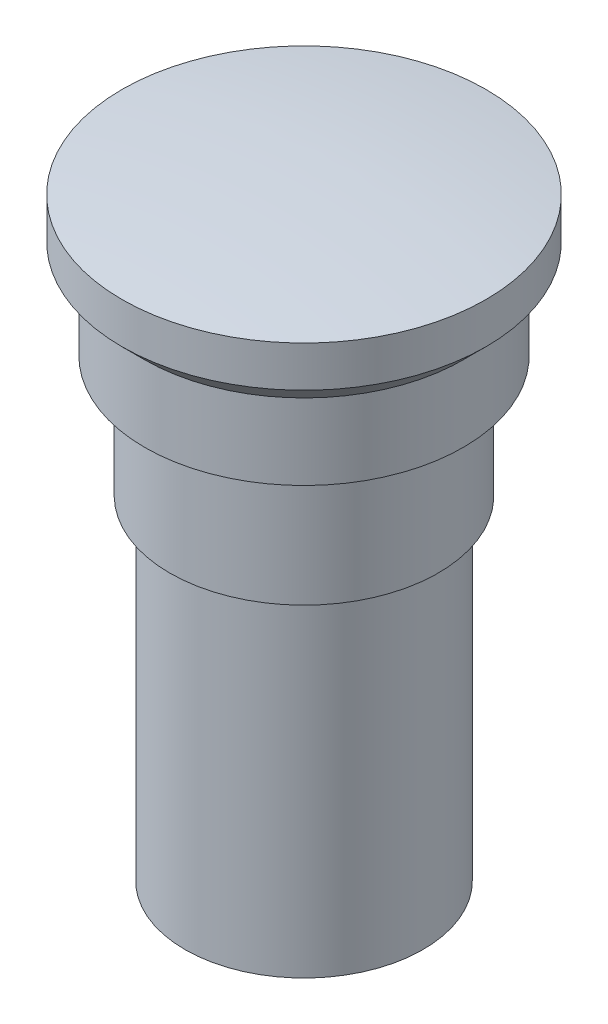
ISO-10303-21;
HEADER;
FILE_DESCRIPTION(('STEP AP214'),'2;1');
FILE_NAME('part.step','',(''),(''),'','','');
FILE_SCHEMA(('AUTOMOTIVE_DESIGN { 1 0 10303 214 1 1 1 1 }'));
ENDSEC;
DATA;
#1=APPLICATION_CONTEXT('core data for automotive mechanical design processes');
#2=APPLICATION_PROTOCOL_DEFINITION('international standard','automotive_design',2000,#1);
#3=PRODUCT_CONTEXT('',#1,'mechanical');
#4=PRODUCT('Part','Part','',(#3));
#5=PRODUCT_RELATED_PRODUCT_CATEGORY('part','',(#4));
#6=PRODUCT_DEFINITION_FORMATION('','',#4);
#7=PRODUCT_DEFINITION_CONTEXT('part definition',#1,'design');
#8=PRODUCT_DEFINITION('design','',#6,#7);
#9=PRODUCT_DEFINITION_SHAPE('','',#8);
#10=(LENGTH_UNIT() NAMED_UNIT(*) SI_UNIT(.MILLI.,.METRE.));
#11=(NAMED_UNIT(*) PLANE_ANGLE_UNIT() SI_UNIT($,.RADIAN.));
#12=(NAMED_UNIT(*) SI_UNIT($,.STERADIAN.) SOLID_ANGLE_UNIT());
#13=UNCERTAINTY_MEASURE_WITH_UNIT(LENGTH_MEASURE(1.E-05),#10,'distance_accuracy_value','');
#14=(GEOMETRIC_REPRESENTATION_CONTEXT(3) GLOBAL_UNCERTAINTY_ASSIGNED_CONTEXT((#13)) GLOBAL_UNIT_ASSIGNED_CONTEXT((#10,
#11,#12)) REPRESENTATION_CONTEXT('',''));
#15=CARTESIAN_POINT('',(0.,0.,0.));
#16=DIRECTION('',(0.,0.,1.));
#17=DIRECTION('',(1.,0.,0.));
#18=AXIS2_PLACEMENT_3D('',#15,#16,#17);
#19=CARTESIAN_POINT('',(0.,-50.,0.));
#20=DIRECTION('',(0.,1.,0.));
#21=DIRECTION('',(1.,0.,0.));
#22=AXIS2_PLACEMENT_3D('',#19,#20,#21);
#23=SPHERICAL_SURFACE('',#22,90.);
#24=CARTESIAN_POINT('',(0.,39.196412483911,0.));
#25=DIRECTION('',(0.,1.,0.));
#26=DIRECTION('',(0.,0.,1.));
#27=AXIS2_PLACEMENT_3D('',#24,#25,#26);
#28=CIRCLE('',#27,12.);
#29=CARTESIAN_POINT('',(0.,39.196412483911,12.));
#30=VERTEX_POINT('',#29);
#31=EDGE_CURVE('E42',#30,#30,#28,.T.);
#32=ORIENTED_EDGE('',*,*,#31,.T.);
#33=EDGE_LOOP('',(#32));
#34=FACE_BOUND('',#33,.T.);
#35=ADVANCED_FACE('F35',(#34),#23,.T.);
#36=CARTESIAN_POINT('',(0.,40.,0.));
#37=DIRECTION('',(0.,1.,0.));
#38=DIRECTION('',(0.,0.,1.));
#39=AXIS2_PLACEMENT_3D('',#36,#37,#38);
#40=CYLINDRICAL_SURFACE('',#39,12.);
#41=CARTESIAN_POINT('',(0.,36.5,0.));
#42=DIRECTION('',(0.,-1.,0.));
#43=DIRECTION('',(0.,0.,-1.));
#44=AXIS2_PLACEMENT_3D('',#41,#42,#43);
#45=CIRCLE('',#44,12.);
#46=CARTESIAN_POINT('',(0.,36.5,-12.));
#47=VERTEX_POINT('',#46);
#48=EDGE_CURVE('E10',#47,#47,#45,.F.);
#49=ORIENTED_EDGE('',*,*,#48,.T.);
#50=EDGE_LOOP('',(#49));
#51=FACE_BOUND('',#50,.T.);
#52=ORIENTED_EDGE('',*,*,#31,.F.);
#53=EDGE_LOOP('',(#52));
#54=FACE_BOUND('',#53,.T.);
#55=ADVANCED_FACE('F82',(#51,#54),#40,.T.);
#56=CARTESIAN_POINT('',(0.,40.,0.));
#57=DIRECTION('',(0.,1.,0.));
#58=DIRECTION('',(0.,0.,1.));
#59=AXIS2_PLACEMENT_3D('',#56,#57,#58);
#60=CYLINDRICAL_SURFACE('',#59,10.5);
#61=CARTESIAN_POINT('',(0.,30.,0.));
#62=DIRECTION('',(0.,1.,0.));
#63=DIRECTION('',(0.,0.,1.));
#64=AXIS2_PLACEMENT_3D('',#61,#62,#63);
#65=CIRCLE('',#64,10.5);
#66=CARTESIAN_POINT('',(0.,30.,10.5));
#67=VERTEX_POINT('',#66);
#68=EDGE_CURVE('E50',#67,#67,#65,.T.);
#69=ORIENTED_EDGE('',*,*,#68,.T.);
#70=EDGE_LOOP('',(#69));
#71=FACE_BOUND('',#70,.T.);
#72=CARTESIAN_POINT('',(0.,35.,0.));
#73=DIRECTION('',(0.,1.,0.));
#74=DIRECTION('',(0.,0.,1.));
#75=AXIS2_PLACEMENT_3D('',#72,#73,#74);
#76=CIRCLE('',#75,10.5);
#77=CARTESIAN_POINT('',(0.,35.,10.5));
#78=VERTEX_POINT('',#77);
#79=EDGE_CURVE('E46',#78,#78,#76,.T.);
#80=ORIENTED_EDGE('',*,*,#79,.F.);
#81=EDGE_LOOP('',(#80));
#82=FACE_BOUND('',#81,.T.);
#83=ADVANCED_FACE('F86',(#71,#82),#60,.T.);
#84=CARTESIAN_POINT('',(-8.85,30.,0.));
#85=DIRECTION('',(0.,-1.,0.));
#86=DIRECTION('',(0.,0.,-1.));
#87=AXIS2_PLACEMENT_3D('',#84,#85,#86);
#88=PLANE('',#87);
#89=CARTESIAN_POINT('',(0.,30.,0.));
#90=DIRECTION('',(0.,1.,0.));
#91=DIRECTION('',(0.,0.,1.));
#92=AXIS2_PLACEMENT_3D('',#89,#90,#91);
#93=CIRCLE('',#92,8.85);
#94=CARTESIAN_POINT('',(0.,30.,8.85));
#95=VERTEX_POINT('',#94);
#96=EDGE_CURVE('E55',#95,#95,#93,.T.);
#97=ORIENTED_EDGE('',*,*,#96,.T.);
#98=EDGE_LOOP('',(#97));
#99=FACE_BOUND('',#98,.T.);
#100=ORIENTED_EDGE('',*,*,#68,.F.);
#101=EDGE_LOOP('',(#100));
#102=FACE_BOUND('',#101,.T.);
#103=ADVANCED_FACE('F91',(#99,#102),#88,.T.);
#104=CARTESIAN_POINT('',(0.,40.,0.));
#105=DIRECTION('',(0.,1.,0.));
#106=DIRECTION('',(0.,0.,1.));
#107=AXIS2_PLACEMENT_3D('',#104,#105,#106);
#108=CYLINDRICAL_SURFACE('',#107,8.85);
#109=CARTESIAN_POINT('',(0.,22.,0.));
#110=DIRECTION('',(0.,1.,0.));
#111=DIRECTION('',(0.,0.,1.));
#112=AXIS2_PLACEMENT_3D('',#109,#110,#111);
#113=CIRCLE('',#112,8.85);
#114=CARTESIAN_POINT('',(0.,22.,8.85));
#115=VERTEX_POINT('',#114);
#116=EDGE_CURVE('E58',#115,#115,#113,.T.);
#117=ORIENTED_EDGE('',*,*,#116,.T.);
#118=EDGE_LOOP('',(#117));
#119=FACE_BOUND('',#118,.T.);
#120=ORIENTED_EDGE('',*,*,#96,.F.);
#121=EDGE_LOOP('',(#120));
#122=FACE_BOUND('',#121,.T.);
#123=ADVANCED_FACE('F95',(#119,#122),#108,.T.);
#124=CARTESIAN_POINT('',(-7.85,22.,0.));
#125=DIRECTION('',(0.,-1.,0.));
#126=DIRECTION('',(0.,0.,-1.));
#127=AXIS2_PLACEMENT_3D('',#124,#125,#126);
#128=PLANE('',#127);
#129=CARTESIAN_POINT('',(0.,22.,0.));
#130=DIRECTION('',(0.,1.,0.));
#131=DIRECTION('',(0.,0.,1.));
#132=AXIS2_PLACEMENT_3D('',#129,#130,#131);
#133=CIRCLE('',#132,7.85);
#134=CARTESIAN_POINT('',(0.,22.,7.85));
#135=VERTEX_POINT('',#134);
#136=EDGE_CURVE('E61',#135,#135,#133,.T.);
#137=ORIENTED_EDGE('',*,*,#136,.T.);
#138=EDGE_LOOP('',(#137));
#139=FACE_BOUND('',#138,.T.);
#140=ORIENTED_EDGE('',*,*,#116,.F.);
#141=EDGE_LOOP('',(#140));
#142=FACE_BOUND('',#141,.T.);
#143=ADVANCED_FACE('F79',(#139,#142),#128,.T.);
#144=CARTESIAN_POINT('',(0.,40.,0.));
#145=DIRECTION('',(0.,1.,0.));
#146=DIRECTION('',(0.,0.,1.));
#147=AXIS2_PLACEMENT_3D('',#144,#145,#146);
#148=CYLINDRICAL_SURFACE('',#147,7.85);
#149=CARTESIAN_POINT('',(0.,0.,0.));
#150=DIRECTION('',(0.,1.,0.));
#151=DIRECTION('',(0.,0.,1.));
#152=AXIS2_PLACEMENT_3D('',#149,#150,#151);
#153=CIRCLE('',#152,7.85);
#154=CARTESIAN_POINT('',(0.,0.,7.85));
#155=VERTEX_POINT('',#154);
#156=EDGE_CURVE('E64',#155,#155,#153,.T.);
#157=ORIENTED_EDGE('',*,*,#156,.T.);
#158=EDGE_LOOP('',(#157));
#159=FACE_BOUND('',#158,.T.);
#160=ORIENTED_EDGE('',*,*,#136,.F.);
#161=EDGE_LOOP('',(#160));
#162=FACE_BOUND('',#161,.T.);
#163=ADVANCED_FACE('F68',(#159,#162),#148,.T.);
#164=CARTESIAN_POINT('',(0.,0.,0.));
#165=DIRECTION('',(0.,-1.,0.));
#166=DIRECTION('',(0.,0.,-1.));
#167=AXIS2_PLACEMENT_3D('',#164,#165,#166);
#168=PLANE('',#167);
#169=ORIENTED_EDGE('',*,*,#156,.F.);
#170=EDGE_LOOP('',(#169));
#171=FACE_BOUND('',#170,.T.);
#172=ADVANCED_FACE('F71',(#171),#168,.T.);
#173=CARTESIAN_POINT('',(0.,36.5,0.));
#174=DIRECTION('',(0.,1.,0.));
#175=DIRECTION('',(0.,0.,1.));
#176=AXIS2_PLACEMENT_3D('',#173,#174,#175);
#177=CONICAL_SURFACE('',#176,12.,0.785398163397452);
#178=ORIENTED_EDGE('',*,*,#79,.T.);
#179=EDGE_LOOP('',(#178));
#180=FACE_BOUND('',#179,.T.);
#181=ORIENTED_EDGE('',*,*,#48,.F.);
#182=EDGE_LOOP('',(#181));
#183=FACE_BOUND('',#182,.T.);
#184=ADVANCED_FACE('F37',(#180,#183),#177,.T.);
#185=CLOSED_SHELL('',(#35,#55,#83,#103,#123,#143,#163,#172,#184));
#186=MANIFOLD_SOLID_BREP('B2',#185);
#187=ADVANCED_BREP_SHAPE_REPRESENTATION('',(#18,#186),#14);
#188=SHAPE_DEFINITION_REPRESENTATION(#9,#187);
ENDSEC;
END-ISO-10303-21;
